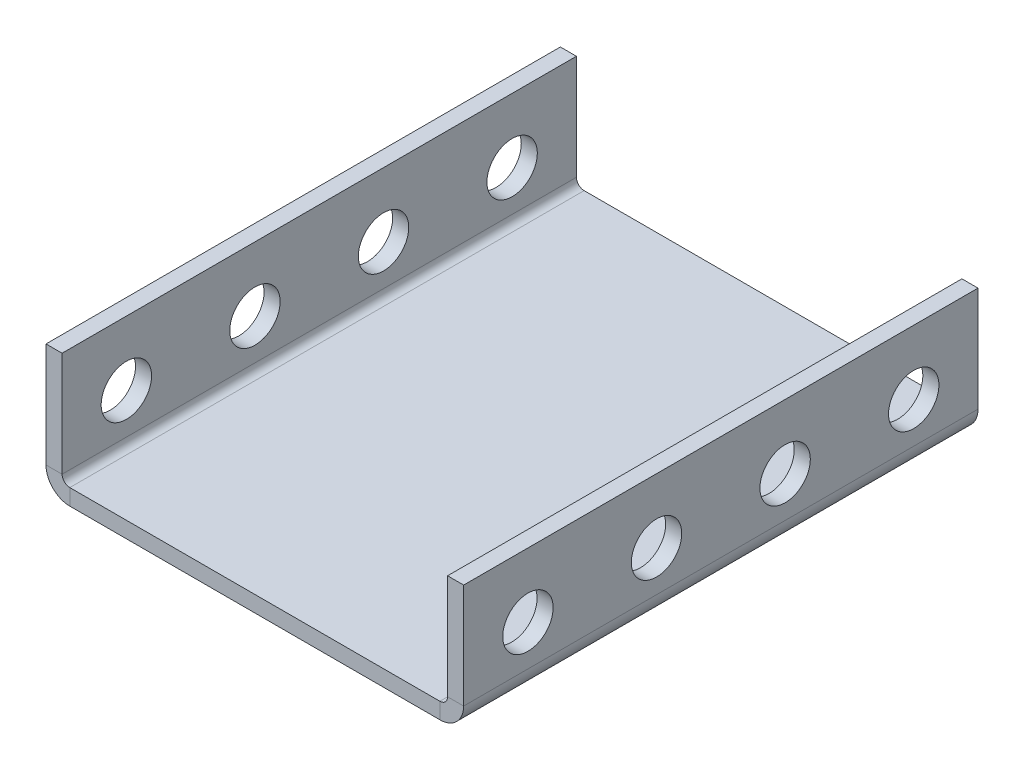
ISO-10303-21;
HEADER;
FILE_DESCRIPTION(('STEP AP214'),'2;1');
FILE_NAME('part.step','',(''),(''),'','','');
FILE_SCHEMA(('AUTOMOTIVE_DESIGN { 1 0 10303 214 1 1 1 1 }'));
ENDSEC;
DATA;
#1=APPLICATION_CONTEXT('core data for automotive mechanical design processes');
#2=APPLICATION_PROTOCOL_DEFINITION('international standard','automotive_design',2000,#1);
#3=PRODUCT_CONTEXT('',#1,'mechanical');
#4=PRODUCT('Part','Part','',(#3));
#5=PRODUCT_RELATED_PRODUCT_CATEGORY('part','',(#4));
#6=PRODUCT_DEFINITION_FORMATION('','',#4);
#7=PRODUCT_DEFINITION_CONTEXT('part definition',#1,'design');
#8=PRODUCT_DEFINITION('design','',#6,#7);
#9=PRODUCT_DEFINITION_SHAPE('','',#8);
#10=(LENGTH_UNIT() NAMED_UNIT(*) SI_UNIT(.MILLI.,.METRE.));
#11=(NAMED_UNIT(*) PLANE_ANGLE_UNIT() SI_UNIT($,.RADIAN.));
#12=(NAMED_UNIT(*) SI_UNIT($,.STERADIAN.) SOLID_ANGLE_UNIT());
#13=UNCERTAINTY_MEASURE_WITH_UNIT(LENGTH_MEASURE(1.E-05),#10,'distance_accuracy_value','');
#14=(GEOMETRIC_REPRESENTATION_CONTEXT(3) GLOBAL_UNCERTAINTY_ASSIGNED_CONTEXT((#13)) GLOBAL_UNIT_ASSIGNED_CONTEXT((#10,
#11,#12)) REPRESENTATION_CONTEXT('',''));
#15=CARTESIAN_POINT('',(0.,0.,0.));
#16=DIRECTION('',(0.,0.,1.));
#17=DIRECTION('',(1.,0.,0.));
#18=AXIS2_PLACEMENT_3D('',#15,#16,#17);
#19=CARTESIAN_POINT('',(18.2753,0.,50.8));
#20=DIRECTION('',(0.,0.,1.));
#21=DIRECTION('',(1.,0.,0.));
#22=AXIS2_PLACEMENT_3D('',#19,#20,#21);
#23=PLANE('',#22);
#24=DIRECTION('',(0.,1.,0.));
#25=VECTOR('',#24,1.);
#26=CARTESIAN_POINT('',(18.2753,0.,50.8));
#27=LINE('',#26,#25);
#28=CARTESIAN_POINT('',(18.2753,0.,50.8));
#29=VERTEX_POINT('',#28);
#30=CARTESIAN_POINT('',(18.2753,1.58750000000001,50.8));
#31=VERTEX_POINT('',#30);
#32=EDGE_CURVE('E11',#29,#31,#27,.T.);
#33=ORIENTED_EDGE('',*,*,#32,.F.);
#34=CARTESIAN_POINT('',(18.2753,2.34950000000001,50.8));
#35=DIRECTION('',(0.,0.,1.));
#36=DIRECTION('',(1.,0.,0.));
#37=AXIS2_PLACEMENT_3D('',#34,#35,#36);
#38=CIRCLE('',#37,2.3495);
#39=CARTESIAN_POINT('',(20.6248,2.34950000000001,50.8));
#40=VERTEX_POINT('',#39);
#41=EDGE_CURVE('E282',#40,#29,#38,.F.);
#42=ORIENTED_EDGE('',*,*,#41,.F.);
#43=DIRECTION('',(1.,0.,0.));
#44=VECTOR('',#43,1.);
#45=CARTESIAN_POINT('',(19.0373,2.34950000000001,50.8));
#46=LINE('',#45,#44);
#47=CARTESIAN_POINT('',(19.0373,2.34950000000001,50.8));
#48=VERTEX_POINT('',#47);
#49=EDGE_CURVE('E54',#48,#40,#46,.T.);
#50=ORIENTED_EDGE('',*,*,#49,.F.);
#51=CARTESIAN_POINT('',(18.2753,2.34950000000001,50.8));
#52=DIRECTION('',(0.,0.,1.));
#53=DIRECTION('',(1.,0.,0.));
#54=AXIS2_PLACEMENT_3D('',#51,#52,#53);
#55=CIRCLE('',#54,0.762);
#56=EDGE_CURVE('E156',#48,#31,#55,.F.);
#57=ORIENTED_EDGE('',*,*,#56,.T.);
#58=EDGE_LOOP('',(#33,#42,#50,#57));
#59=FACE_BOUND('',#58,.T.);
#60=ADVANCED_FACE('F45',(#59),#23,.T.);
#61=CARTESIAN_POINT('',(19.0373,2.34950000000001,50.8));
#62=DIRECTION('',(0.,0.,1.));
#63=DIRECTION('',(1.,0.,0.));
#64=AXIS2_PLACEMENT_3D('',#61,#62,#63);
#65=PLANE('',#64);
#66=DIRECTION('',(-1.,0.,0.));
#67=VECTOR('',#66,1.);
#68=CARTESIAN_POINT('',(-20.6248,0.,50.8));
#69=LINE('',#68,#67);
#70=CARTESIAN_POINT('',(-18.2753,0.,50.8));
#71=VERTEX_POINT('',#70);
#72=EDGE_CURVE('E150',#29,#71,#69,.T.);
#73=ORIENTED_EDGE('',*,*,#72,.F.);
#74=ORIENTED_EDGE('',*,*,#32,.T.);
#75=DIRECTION('',(-1.,0.,0.));
#76=VECTOR('',#75,1.);
#77=CARTESIAN_POINT('',(-20.6248,1.5875,50.8));
#78=LINE('',#77,#76);
#79=CARTESIAN_POINT('',(-18.2753,1.5875,50.8));
#80=VERTEX_POINT('',#79);
#81=EDGE_CURVE('E147',#31,#80,#78,.T.);
#82=ORIENTED_EDGE('',*,*,#81,.T.);
#83=DIRECTION('',(0.,-1.,0.));
#84=VECTOR('',#83,1.);
#85=CARTESIAN_POINT('',(-18.2753,1.5875,50.8));
#86=LINE('',#85,#84);
#87=EDGE_CURVE('E239',#80,#71,#86,.T.);
#88=ORIENTED_EDGE('',*,*,#87,.T.);
#89=EDGE_LOOP('',(#73,#74,#82,#88));
#90=FACE_BOUND('',#89,.T.);
#91=ADVANCED_FACE('F145',(#90),#65,.T.);
#92=CARTESIAN_POINT('',(20.6248,2.34950000000001,0.));
#93=DIRECTION('',(0.,0.,-1.));
#94=DIRECTION('',(-1.,0.,0.));
#95=AXIS2_PLACEMENT_3D('',#92,#93,#94);
#96=PLANE('',#95);
#97=DIRECTION('',(-1.,0.,0.));
#98=VECTOR('',#97,1.);
#99=CARTESIAN_POINT('',(20.6248,2.34950000000001,0.));
#100=LINE('',#99,#98);
#101=CARTESIAN_POINT('',(20.6248,2.34950000000001,0.));
#102=VERTEX_POINT('',#101);
#103=CARTESIAN_POINT('',(19.0373,2.34950000000001,0.));
#104=VERTEX_POINT('',#103);
#105=EDGE_CURVE('E244',#102,#104,#100,.T.);
#106=ORIENTED_EDGE('',*,*,#105,.F.);
#107=CARTESIAN_POINT('',(18.2753,2.34950000000001,0.));
#108=DIRECTION('',(0.,0.,1.));
#109=DIRECTION('',(1.,0.,0.));
#110=AXIS2_PLACEMENT_3D('',#107,#108,#109);
#111=CIRCLE('',#110,2.3495);
#112=CARTESIAN_POINT('',(18.2753,0.,0.));
#113=VERTEX_POINT('',#112);
#114=EDGE_CURVE('E196',#102,#113,#111,.F.);
#115=ORIENTED_EDGE('',*,*,#114,.T.);
#116=DIRECTION('',(0.,-1.,0.));
#117=VECTOR('',#116,1.);
#118=CARTESIAN_POINT('',(18.2753,1.58750000000001,0.));
#119=LINE('',#118,#117);
#120=CARTESIAN_POINT('',(18.2753,1.58750000000001,0.));
#121=VERTEX_POINT('',#120);
#122=EDGE_CURVE('E242',#121,#113,#119,.T.);
#123=ORIENTED_EDGE('',*,*,#122,.F.);
#124=CARTESIAN_POINT('',(18.2753,2.34950000000001,0.));
#125=DIRECTION('',(0.,0.,1.));
#126=DIRECTION('',(1.,0.,0.));
#127=AXIS2_PLACEMENT_3D('',#124,#125,#126);
#128=CIRCLE('',#127,0.762);
#129=EDGE_CURVE('E168',#104,#121,#128,.F.);
#130=ORIENTED_EDGE('',*,*,#129,.F.);
#131=EDGE_LOOP('',(#106,#115,#123,#130));
#132=FACE_BOUND('',#131,.T.);
#133=ADVANCED_FACE('F300',(#132),#96,.T.);
#134=CARTESIAN_POINT('',(18.2753,1.58750000000001,0.));
#135=DIRECTION('',(0.,0.,-1.));
#136=DIRECTION('',(-1.,0.,0.));
#137=AXIS2_PLACEMENT_3D('',#134,#135,#136);
#138=PLANE('',#137);
#139=DIRECTION('',(0.,-1.,0.));
#140=VECTOR('',#139,1.);
#141=CARTESIAN_POINT('',(20.6248,0.,0.));
#142=LINE('',#141,#140);
#143=CARTESIAN_POINT('',(20.6248,12.7,0.));
#144=VERTEX_POINT('',#143);
#145=EDGE_CURVE('E199',#144,#102,#142,.T.);
#146=ORIENTED_EDGE('',*,*,#145,.T.);
#147=ORIENTED_EDGE('',*,*,#105,.T.);
#148=DIRECTION('',(0.,-1.,0.));
#149=VECTOR('',#148,1.);
#150=CARTESIAN_POINT('',(19.0373,0.,0.));
#151=LINE('',#150,#149);
#152=CARTESIAN_POINT('',(19.0373,12.7,0.));
#153=VERTEX_POINT('',#152);
#154=EDGE_CURVE('E205',#153,#104,#151,.T.);
#155=ORIENTED_EDGE('',*,*,#154,.F.);
#156=DIRECTION('',(1.,0.,0.));
#157=VECTOR('',#156,1.);
#158=CARTESIAN_POINT('',(19.0373,12.7,0.));
#159=LINE('',#158,#157);
#160=EDGE_CURVE('E202',#153,#144,#159,.T.);
#161=ORIENTED_EDGE('',*,*,#160,.T.);
#162=EDGE_LOOP('',(#146,#147,#155,#161));
#163=FACE_BOUND('',#162,.T.);
#164=ADVANCED_FACE('F350',(#163),#138,.T.);
#165=CARTESIAN_POINT('',(-20.6248,2.3495,50.8));
#166=DIRECTION('',(0.,0.,1.));
#167=DIRECTION('',(1.,0.,0.));
#168=AXIS2_PLACEMENT_3D('',#165,#166,#167);
#169=PLANE('',#168);
#170=DIRECTION('',(1.,0.,0.));
#171=VECTOR('',#170,1.);
#172=CARTESIAN_POINT('',(-20.6248,2.3495,50.8));
#173=LINE('',#172,#171);
#174=CARTESIAN_POINT('',(-20.6248,2.3495,50.8));
#175=VERTEX_POINT('',#174);
#176=CARTESIAN_POINT('',(-19.0373,2.3495,50.8));
#177=VERTEX_POINT('',#176);
#178=EDGE_CURVE('E63',#175,#177,#173,.T.);
#179=ORIENTED_EDGE('',*,*,#178,.F.);
#180=CARTESIAN_POINT('',(-18.2753,2.3495,50.8));
#181=DIRECTION('',(0.,0.,1.));
#182=DIRECTION('',(1.,0.,0.));
#183=AXIS2_PLACEMENT_3D('',#180,#181,#182);
#184=CIRCLE('',#183,2.3495);
#185=EDGE_CURVE('E278',#71,#175,#184,.F.);
#186=ORIENTED_EDGE('',*,*,#185,.F.);
#187=ORIENTED_EDGE('',*,*,#87,.F.);
#188=CARTESIAN_POINT('',(-18.2753,2.3495,50.8));
#189=DIRECTION('',(0.,0.,1.));
#190=DIRECTION('',(1.,0.,0.));
#191=AXIS2_PLACEMENT_3D('',#188,#189,#190);
#192=CIRCLE('',#191,0.762);
#193=EDGE_CURVE('E176',#80,#177,#192,.F.);
#194=ORIENTED_EDGE('',*,*,#193,.T.);
#195=EDGE_LOOP('',(#179,#186,#187,#194));
#196=FACE_BOUND('',#195,.T.);
#197=ADVANCED_FACE('F355',(#196),#169,.T.);
#198=CARTESIAN_POINT('',(-18.2753,1.5875,50.8));
#199=DIRECTION('',(0.,0.,1.));
#200=DIRECTION('',(1.,0.,0.));
#201=AXIS2_PLACEMENT_3D('',#198,#199,#200);
#202=PLANE('',#201);
#203=DIRECTION('',(0.,1.,0.));
#204=VECTOR('',#203,1.);
#205=CARTESIAN_POINT('',(-20.6248,0.,50.8));
#206=LINE('',#205,#204);
#207=CARTESIAN_POINT('',(-20.6248,12.7,50.8));
#208=VERTEX_POINT('',#207);
#209=EDGE_CURVE('E275',#175,#208,#206,.T.);
#210=ORIENTED_EDGE('',*,*,#209,.F.);
#211=ORIENTED_EDGE('',*,*,#178,.T.);
#212=DIRECTION('',(0.,1.,0.));
#213=VECTOR('',#212,1.);
#214=CARTESIAN_POINT('',(-19.0373,0.,50.8));
#215=LINE('',#214,#213);
#216=CARTESIAN_POINT('',(-19.0373,12.7,50.8));
#217=VERTEX_POINT('',#216);
#218=EDGE_CURVE('E117',#177,#217,#215,.T.);
#219=ORIENTED_EDGE('',*,*,#218,.T.);
#220=DIRECTION('',(1.,0.,0.));
#221=VECTOR('',#220,1.);
#222=CARTESIAN_POINT('',(-20.6248,12.7,50.8));
#223=LINE('',#222,#221);
#224=EDGE_CURVE('E272',#208,#217,#223,.T.);
#225=ORIENTED_EDGE('',*,*,#224,.F.);
#226=EDGE_LOOP('',(#210,#211,#219,#225));
#227=FACE_BOUND('',#226,.T.);
#228=ADVANCED_FACE('F327',(#227),#202,.T.);
#229=CARTESIAN_POINT('',(-18.2753,0.,0.));
#230=DIRECTION('',(0.,0.,-1.));
#231=DIRECTION('',(-1.,0.,0.));
#232=AXIS2_PLACEMENT_3D('',#229,#230,#231);
#233=PLANE('',#232);
#234=DIRECTION('',(0.,1.,0.));
#235=VECTOR('',#234,1.);
#236=CARTESIAN_POINT('',(-18.2753,0.,0.));
#237=LINE('',#236,#235);
#238=CARTESIAN_POINT('',(-18.2753,0.,0.));
#239=VERTEX_POINT('',#238);
#240=CARTESIAN_POINT('',(-18.2753,1.5875,0.));
#241=VERTEX_POINT('',#240);
#242=EDGE_CURVE('E104',#239,#241,#237,.T.);
#243=ORIENTED_EDGE('',*,*,#242,.F.);
#244=CARTESIAN_POINT('',(-18.2753,2.3495,0.));
#245=DIRECTION('',(0.,0.,1.));
#246=DIRECTION('',(1.,0.,0.));
#247=AXIS2_PLACEMENT_3D('',#244,#245,#246);
#248=CIRCLE('',#247,2.3495);
#249=CARTESIAN_POINT('',(-20.6248,2.3495,0.));
#250=VERTEX_POINT('',#249);
#251=EDGE_CURVE('E192',#239,#250,#248,.F.);
#252=ORIENTED_EDGE('',*,*,#251,.T.);
#253=DIRECTION('',(-1.,0.,0.));
#254=VECTOR('',#253,1.);
#255=CARTESIAN_POINT('',(-19.0373,2.3495,0.));
#256=LINE('',#255,#254);
#257=CARTESIAN_POINT('',(-19.0373,2.3495,0.));
#258=VERTEX_POINT('',#257);
#259=EDGE_CURVE('E111',#258,#250,#256,.T.);
#260=ORIENTED_EDGE('',*,*,#259,.F.);
#261=CARTESIAN_POINT('',(-18.2753,2.3495,0.));
#262=DIRECTION('',(0.,0.,1.));
#263=DIRECTION('',(1.,0.,0.));
#264=AXIS2_PLACEMENT_3D('',#261,#262,#263);
#265=CIRCLE('',#264,0.762);
#266=EDGE_CURVE('E211',#241,#258,#265,.F.);
#267=ORIENTED_EDGE('',*,*,#266,.F.);
#268=EDGE_LOOP('',(#243,#252,#260,#267));
#269=FACE_BOUND('',#268,.T.);
#270=ADVANCED_FACE('F315',(#269),#233,.T.);
#271=CARTESIAN_POINT('',(-19.0373,2.3495,0.));
#272=DIRECTION('',(0.,0.,-1.));
#273=DIRECTION('',(-1.,0.,0.));
#274=AXIS2_PLACEMENT_3D('',#271,#272,#273);
#275=PLANE('',#274);
#276=DIRECTION('',(-1.,0.,0.));
#277=VECTOR('',#276,1.);
#278=CARTESIAN_POINT('',(-20.6248,0.,0.));
#279=LINE('',#278,#277);
#280=EDGE_CURVE('E194',#113,#239,#279,.T.);
#281=ORIENTED_EDGE('',*,*,#280,.T.);
#282=ORIENTED_EDGE('',*,*,#242,.T.);
#283=DIRECTION('',(-1.,0.,0.));
#284=VECTOR('',#283,1.);
#285=CARTESIAN_POINT('',(-20.6248,1.5875,0.));
#286=LINE('',#285,#284);
#287=EDGE_CURVE('E209',#121,#241,#286,.T.);
#288=ORIENTED_EDGE('',*,*,#287,.F.);
#289=ORIENTED_EDGE('',*,*,#122,.T.);
#290=EDGE_LOOP('',(#281,#282,#288,#289));
#291=FACE_BOUND('',#290,.T.);
#292=ADVANCED_FACE('F302',(#291),#275,.T.);
#293=CARTESIAN_POINT('',(-19.0373,0.,50.8));
#294=DIRECTION('',(-1.,0.,0.));
#295=DIRECTION('',(0.,-1.,0.));
#296=AXIS2_PLACEMENT_3D('',#293,#294,#295);
#297=PLANE('',#296);
#298=CARTESIAN_POINT('',(-19.0373,6.35000000000001,44.45));
#299=DIRECTION('',(-1.,0.,0.));
#300=DIRECTION('',(0.,-1.,0.));
#301=AXIS2_PLACEMENT_3D('',#298,#299,#300);
#302=CIRCLE('',#301,2.4892);
#303=CARTESIAN_POINT('',(-19.0373,3.86080000000001,44.45));
#304=VERTEX_POINT('',#303);
#305=EDGE_CURVE('E186',#304,#304,#302,.T.);
#306=ORIENTED_EDGE('',*,*,#305,.T.);
#307=EDGE_LOOP('',(#306));
#308=FACE_BOUND('',#307,.T.);
#309=CARTESIAN_POINT('',(-19.0373,6.35000000000001,31.75));
#310=DIRECTION('',(-1.,0.,0.));
#311=DIRECTION('',(0.,-1.,0.));
#312=AXIS2_PLACEMENT_3D('',#309,#310,#311);
#313=CIRCLE('',#312,2.4892);
#314=CARTESIAN_POINT('',(-19.0373,3.8608,31.75));
#315=VERTEX_POINT('',#314);
#316=EDGE_CURVE('E257',#315,#315,#313,.T.);
#317=ORIENTED_EDGE('',*,*,#316,.T.);
#318=EDGE_LOOP('',(#317));
#319=FACE_BOUND('',#318,.T.);
#320=CARTESIAN_POINT('',(-19.0373,6.35000000000001,19.05));
#321=DIRECTION('',(-1.,0.,0.));
#322=DIRECTION('',(0.,-1.,0.));
#323=AXIS2_PLACEMENT_3D('',#320,#321,#322);
#324=CIRCLE('',#323,2.4892);
#325=CARTESIAN_POINT('',(-19.0373,3.86080000000001,19.05));
#326=VERTEX_POINT('',#325);
#327=EDGE_CURVE('E254',#326,#326,#324,.T.);
#328=ORIENTED_EDGE('',*,*,#327,.T.);
#329=EDGE_LOOP('',(#328));
#330=FACE_BOUND('',#329,.T.);
#331=CARTESIAN_POINT('',(-19.0373,6.35000000000001,6.35000000000001));
#332=DIRECTION('',(-1.,0.,0.));
#333=DIRECTION('',(0.,-1.,0.));
#334=AXIS2_PLACEMENT_3D('',#331,#332,#333);
#335=CIRCLE('',#334,2.4892);
#336=CARTESIAN_POINT('',(-19.0373,3.86080000000001,6.35000000000001));
#337=VERTEX_POINT('',#336);
#338=EDGE_CURVE('E250',#337,#337,#335,.T.);
#339=ORIENTED_EDGE('',*,*,#338,.T.);
#340=EDGE_LOOP('',(#339));
#341=FACE_BOUND('',#340,.T.);
#342=DIRECTION('',(0.,1.,0.));
#343=VECTOR('',#342,1.);
#344=CARTESIAN_POINT('',(-19.0373,0.,0.));
#345=LINE('',#344,#343);
#346=CARTESIAN_POINT('',(-19.0373,12.7,0.));
#347=VERTEX_POINT('',#346);
#348=EDGE_CURVE('E182',#258,#347,#345,.T.);
#349=ORIENTED_EDGE('',*,*,#348,.T.);
#350=DIRECTION('',(0.,0.,-1.));
#351=VECTOR('',#350,1.);
#352=CARTESIAN_POINT('',(-19.0373,12.7,50.8));
#353=LINE('',#352,#351);
#354=EDGE_CURVE('E235',#217,#347,#353,.T.);
#355=ORIENTED_EDGE('',*,*,#354,.F.);
#356=ORIENTED_EDGE('',*,*,#218,.F.);
#357=DIRECTION('',(0.,0.,-1.));
#358=VECTOR('',#357,1.);
#359=CARTESIAN_POINT('',(-19.0373,2.3495,50.8));
#360=LINE('',#359,#358);
#361=EDGE_CURVE('E178',#177,#258,#360,.T.);
#362=ORIENTED_EDGE('',*,*,#361,.T.);
#363=EDGE_LOOP('',(#349,#355,#356,#362));
#364=FACE_BOUND('',#363,.T.);
#365=ADVANCED_FACE('F321',(#308,#319,#330,#341,#364),#297,.F.);
#366=CARTESIAN_POINT('',(-20.6248,12.7,50.8));
#367=DIRECTION('',(0.,1.,0.));
#368=DIRECTION('',(0.,0.,1.));
#369=AXIS2_PLACEMENT_3D('',#366,#367,#368);
#370=PLANE('',#369);
#371=DIRECTION('',(1.,0.,0.));
#372=VECTOR('',#371,1.);
#373=CARTESIAN_POINT('',(-20.6248,12.7,0.));
#374=LINE('',#373,#372);
#375=CARTESIAN_POINT('',(-20.6248,12.7,0.));
#376=VERTEX_POINT('',#375);
#377=EDGE_CURVE('E185',#376,#347,#374,.T.);
#378=ORIENTED_EDGE('',*,*,#377,.F.);
#379=DIRECTION('',(0.,0.,-1.));
#380=VECTOR('',#379,1.);
#381=CARTESIAN_POINT('',(-20.6248,12.7,50.8));
#382=LINE('',#381,#380);
#383=EDGE_CURVE('E233',#208,#376,#382,.T.);
#384=ORIENTED_EDGE('',*,*,#383,.F.);
#385=ORIENTED_EDGE('',*,*,#224,.T.);
#386=ORIENTED_EDGE('',*,*,#354,.T.);
#387=EDGE_LOOP('',(#378,#384,#385,#386));
#388=FACE_BOUND('',#387,.T.);
#389=ADVANCED_FACE('F326',(#388),#370,.T.);
#390=CARTESIAN_POINT('',(-20.6248,0.,50.8));
#391=DIRECTION('',(-1.,0.,0.));
#392=DIRECTION('',(0.,-1.,0.));
#393=AXIS2_PLACEMENT_3D('',#390,#391,#392);
#394=PLANE('',#393);
#395=CARTESIAN_POINT('',(-20.6248,6.35000000000001,44.45));
#396=DIRECTION('',(1.,0.,0.));
#397=DIRECTION('',(0.,0.,-1.));
#398=AXIS2_PLACEMENT_3D('',#395,#396,#397);
#399=CIRCLE('',#398,2.4892);
#400=CARTESIAN_POINT('',(-20.6248,6.35000000000001,41.9608));
#401=VERTEX_POINT('',#400);
#402=EDGE_CURVE('E251',#401,#401,#399,.T.);
#403=ORIENTED_EDGE('',*,*,#402,.T.);
#404=EDGE_LOOP('',(#403));
#405=FACE_BOUND('',#404,.T.);
#406=CARTESIAN_POINT('',(-20.6248,6.35000000000001,31.75));
#407=DIRECTION('',(1.,0.,0.));
#408=DIRECTION('',(0.,0.,-1.));
#409=AXIS2_PLACEMENT_3D('',#406,#407,#408);
#410=CIRCLE('',#409,2.4892);
#411=CARTESIAN_POINT('',(-20.6248,6.35000000000001,29.2608));
#412=VERTEX_POINT('',#411);
#413=EDGE_CURVE('E676',#412,#412,#410,.T.);
#414=ORIENTED_EDGE('',*,*,#413,.T.);
#415=EDGE_LOOP('',(#414));
#416=FACE_BOUND('',#415,.T.);
#417=CARTESIAN_POINT('',(-20.6248,6.35000000000001,19.05));
#418=DIRECTION('',(1.,0.,0.));
#419=DIRECTION('',(0.,0.,-1.));
#420=AXIS2_PLACEMENT_3D('',#417,#418,#419);
#421=CIRCLE('',#420,2.4892);
#422=CARTESIAN_POINT('',(-20.6248,6.35000000000001,16.5608));
#423=VERTEX_POINT('',#422);
#424=EDGE_CURVE('E682',#423,#423,#421,.T.);
#425=ORIENTED_EDGE('',*,*,#424,.T.);
#426=EDGE_LOOP('',(#425));
#427=FACE_BOUND('',#426,.T.);
#428=CARTESIAN_POINT('',(-20.6248,6.35000000000001,6.35000000000001));
#429=DIRECTION('',(1.,0.,0.));
#430=DIRECTION('',(0.,0.,-1.));
#431=AXIS2_PLACEMENT_3D('',#428,#429,#430);
#432=CIRCLE('',#431,2.4892);
#433=CARTESIAN_POINT('',(-20.6248,6.35000000000001,3.86080000000001));
#434=VERTEX_POINT('',#433);
#435=EDGE_CURVE('E687',#434,#434,#432,.T.);
#436=ORIENTED_EDGE('',*,*,#435,.T.);
#437=EDGE_LOOP('',(#436));
#438=FACE_BOUND('',#437,.T.);
#439=DIRECTION('',(0.,1.,0.));
#440=VECTOR('',#439,1.);
#441=CARTESIAN_POINT('',(-20.6248,0.,0.));
#442=LINE('',#441,#440);
#443=EDGE_CURVE('E189',#250,#376,#442,.T.);
#444=ORIENTED_EDGE('',*,*,#443,.F.);
#445=DIRECTION('',(0.,0.,-1.));
#446=VECTOR('',#445,1.);
#447=CARTESIAN_POINT('',(-20.6248,2.3495,50.8));
#448=LINE('',#447,#446);
#449=EDGE_CURVE('E230',#175,#250,#448,.T.);
#450=ORIENTED_EDGE('',*,*,#449,.F.);
#451=ORIENTED_EDGE('',*,*,#209,.T.);
#452=ORIENTED_EDGE('',*,*,#383,.T.);
#453=EDGE_LOOP('',(#444,#450,#451,#452));
#454=FACE_BOUND('',#453,.T.);
#455=ADVANCED_FACE('F329',(#405,#416,#427,#438,#454),#394,.T.);
#456=CARTESIAN_POINT('',(-18.2753,2.3495,50.8));
#457=DIRECTION('',(0.,0.,-1.));
#458=DIRECTION('',(-1.,0.,0.));
#459=AXIS2_PLACEMENT_3D('',#456,#457,#458);
#460=CYLINDRICAL_SURFACE('',#459,2.3495);
#461=ORIENTED_EDGE('',*,*,#251,.F.);
#462=DIRECTION('',(0.,0.,-1.));
#463=VECTOR('',#462,1.);
#464=CARTESIAN_POINT('',(-18.2753,0.,50.8));
#465=LINE('',#464,#463);
#466=EDGE_CURVE('E227',#71,#239,#465,.T.);
#467=ORIENTED_EDGE('',*,*,#466,.F.);
#468=ORIENTED_EDGE('',*,*,#185,.T.);
#469=ORIENTED_EDGE('',*,*,#449,.T.);
#470=EDGE_LOOP('',(#461,#467,#468,#469));
#471=FACE_BOUND('',#470,.T.);
#472=ADVANCED_FACE('F312',(#471),#460,.T.);
#473=CARTESIAN_POINT('',(-20.6248,0.,50.8));
#474=DIRECTION('',(0.,-1.,0.));
#475=DIRECTION('',(1.,0.,0.));
#476=AXIS2_PLACEMENT_3D('',#473,#474,#475);
#477=PLANE('',#476);
#478=ORIENTED_EDGE('',*,*,#280,.F.);
#479=DIRECTION('',(0.,0.,-1.));
#480=VECTOR('',#479,1.);
#481=CARTESIAN_POINT('',(18.2753,0.,50.8));
#482=LINE('',#481,#480);
#483=EDGE_CURVE('E224',#29,#113,#482,.T.);
#484=ORIENTED_EDGE('',*,*,#483,.F.);
#485=ORIENTED_EDGE('',*,*,#72,.T.);
#486=ORIENTED_EDGE('',*,*,#466,.T.);
#487=EDGE_LOOP('',(#478,#484,#485,#486));
#488=FACE_BOUND('',#487,.T.);
#489=ADVANCED_FACE('F307',(#488),#477,.T.);
#490=CARTESIAN_POINT('',(18.2753,2.34950000000001,50.8));
#491=DIRECTION('',(0.,0.,-1.));
#492=DIRECTION('',(-1.,0.,0.));
#493=AXIS2_PLACEMENT_3D('',#490,#491,#492);
#494=CYLINDRICAL_SURFACE('',#493,2.3495);
#495=ORIENTED_EDGE('',*,*,#114,.F.);
#496=DIRECTION('',(0.,0.,-1.));
#497=VECTOR('',#496,1.);
#498=CARTESIAN_POINT('',(20.6248,2.34950000000001,50.8));
#499=LINE('',#498,#497);
#500=EDGE_CURVE('E221',#40,#102,#499,.T.);
#501=ORIENTED_EDGE('',*,*,#500,.F.);
#502=ORIENTED_EDGE('',*,*,#41,.T.);
#503=ORIENTED_EDGE('',*,*,#483,.T.);
#504=EDGE_LOOP('',(#495,#501,#502,#503));
#505=FACE_BOUND('',#504,.T.);
#506=ADVANCED_FACE('F305',(#505),#494,.T.);
#507=CARTESIAN_POINT('',(20.6248,0.,50.8));
#508=DIRECTION('',(1.,0.,0.));
#509=DIRECTION('',(0.,1.,0.));
#510=AXIS2_PLACEMENT_3D('',#507,#508,#509);
#511=PLANE('',#510);
#512=CARTESIAN_POINT('',(20.6248,6.35000000000001,44.45));
#513=DIRECTION('',(1.,0.,0.));
#514=DIRECTION('',(0.,0.,-1.));
#515=AXIS2_PLACEMENT_3D('',#512,#513,#514);
#516=CIRCLE('',#515,2.4892);
#517=CARTESIAN_POINT('',(20.6248,6.35000000000001,41.9608));
#518=VERTEX_POINT('',#517);
#519=EDGE_CURVE('E670',#518,#518,#516,.T.);
#520=ORIENTED_EDGE('',*,*,#519,.F.);
#521=EDGE_LOOP('',(#520));
#522=FACE_BOUND('',#521,.T.);
#523=CARTESIAN_POINT('',(20.6248,6.35000000000001,31.75));
#524=DIRECTION('',(1.,0.,0.));
#525=DIRECTION('',(0.,0.,-1.));
#526=AXIS2_PLACEMENT_3D('',#523,#524,#525);
#527=CIRCLE('',#526,2.4892);
#528=CARTESIAN_POINT('',(20.6248,6.35000000000001,29.2608));
#529=VERTEX_POINT('',#528);
#530=EDGE_CURVE('E673',#529,#529,#527,.T.);
#531=ORIENTED_EDGE('',*,*,#530,.F.);
#532=EDGE_LOOP('',(#531));
#533=FACE_BOUND('',#532,.T.);
#534=CARTESIAN_POINT('',(20.6248,6.35000000000001,19.05));
#535=DIRECTION('',(1.,0.,0.));
#536=DIRECTION('',(0.,0.,-1.));
#537=AXIS2_PLACEMENT_3D('',#534,#535,#536);
#538=CIRCLE('',#537,2.4892);
#539=CARTESIAN_POINT('',(20.6248,6.35000000000001,16.5608));
#540=VERTEX_POINT('',#539);
#541=EDGE_CURVE('E679',#540,#540,#538,.T.);
#542=ORIENTED_EDGE('',*,*,#541,.F.);
#543=EDGE_LOOP('',(#542));
#544=FACE_BOUND('',#543,.T.);
#545=CARTESIAN_POINT('',(20.6248,6.35000000000001,6.35000000000001));
#546=DIRECTION('',(1.,0.,0.));
#547=DIRECTION('',(0.,0.,-1.));
#548=AXIS2_PLACEMENT_3D('',#545,#546,#547);
#549=CIRCLE('',#548,2.4892);
#550=CARTESIAN_POINT('',(20.6248,6.35000000000001,3.86080000000001));
#551=VERTEX_POINT('',#550);
#552=EDGE_CURVE('E409',#551,#551,#549,.T.);
#553=ORIENTED_EDGE('',*,*,#552,.F.);
#554=EDGE_LOOP('',(#553));
#555=FACE_BOUND('',#554,.T.);
#556=ORIENTED_EDGE('',*,*,#145,.F.);
#557=DIRECTION('',(0.,0.,-1.));
#558=VECTOR('',#557,1.);
#559=CARTESIAN_POINT('',(20.6248,12.7,50.8));
#560=LINE('',#559,#558);
#561=CARTESIAN_POINT('',(20.6248,12.7,50.8));
#562=VERTEX_POINT('',#561);
#563=EDGE_CURVE('E219',#562,#144,#560,.T.);
#564=ORIENTED_EDGE('',*,*,#563,.F.);
#565=DIRECTION('',(0.,-1.,0.));
#566=VECTOR('',#565,1.);
#567=CARTESIAN_POINT('',(20.6248,0.,50.8));
#568=LINE('',#567,#566);
#569=EDGE_CURVE('E284',#562,#40,#568,.T.);
#570=ORIENTED_EDGE('',*,*,#569,.T.);
#571=ORIENTED_EDGE('',*,*,#500,.T.);
#572=EDGE_LOOP('',(#556,#564,#570,#571));
#573=FACE_BOUND('',#572,.T.);
#574=ADVANCED_FACE('F420',(#522,#533,#544,#555,#573),#511,.T.);
#575=CARTESIAN_POINT('',(19.0373,12.7,50.8));
#576=DIRECTION('',(0.,1.,0.));
#577=DIRECTION('',(0.,0.,1.));
#578=AXIS2_PLACEMENT_3D('',#575,#576,#577);
#579=PLANE('',#578);
#580=ORIENTED_EDGE('',*,*,#160,.F.);
#581=DIRECTION('',(0.,0.,-1.));
#582=VECTOR('',#581,1.);
#583=CARTESIAN_POINT('',(19.0373,12.7,50.8));
#584=LINE('',#583,#582);
#585=CARTESIAN_POINT('',(19.0373,12.7,50.8));
#586=VERTEX_POINT('',#585);
#587=EDGE_CURVE('E217',#586,#153,#584,.T.);
#588=ORIENTED_EDGE('',*,*,#587,.F.);
#589=DIRECTION('',(1.,0.,0.));
#590=VECTOR('',#589,1.);
#591=CARTESIAN_POINT('',(19.0373,12.7,50.8));
#592=LINE('',#591,#590);
#593=EDGE_CURVE('E287',#586,#562,#592,.T.);
#594=ORIENTED_EDGE('',*,*,#593,.T.);
#595=ORIENTED_EDGE('',*,*,#563,.T.);
#596=EDGE_LOOP('',(#580,#588,#594,#595));
#597=FACE_BOUND('',#596,.T.);
#598=ADVANCED_FACE('F412',(#597),#579,.T.);
#599=CARTESIAN_POINT('',(19.0373,0.,50.8));
#600=DIRECTION('',(1.,0.,0.));
#601=DIRECTION('',(0.,1.,0.));
#602=AXIS2_PLACEMENT_3D('',#599,#600,#601);
#603=PLANE('',#602);
#604=CARTESIAN_POINT('',(19.0373,6.35000000000001,44.45));
#605=DIRECTION('',(1.,0.,0.));
#606=DIRECTION('',(0.,1.,0.));
#607=AXIS2_PLACEMENT_3D('',#604,#605,#606);
#608=CIRCLE('',#607,2.4892);
#609=CARTESIAN_POINT('',(19.0373,8.8392,44.45));
#610=VERTEX_POINT('',#609);
#611=EDGE_CURVE('E48',#610,#610,#608,.T.);
#612=ORIENTED_EDGE('',*,*,#611,.T.);
#613=EDGE_LOOP('',(#612));
#614=FACE_BOUND('',#613,.T.);
#615=CARTESIAN_POINT('',(19.0373,6.35000000000001,31.75));
#616=DIRECTION('',(1.,0.,0.));
#617=DIRECTION('',(0.,1.,0.));
#618=AXIS2_PLACEMENT_3D('',#615,#616,#617);
#619=CIRCLE('',#618,2.4892);
#620=CARTESIAN_POINT('',(19.0373,8.83920000000001,31.75));
#621=VERTEX_POINT('',#620);
#622=EDGE_CURVE('E255',#621,#621,#619,.T.);
#623=ORIENTED_EDGE('',*,*,#622,.T.);
#624=EDGE_LOOP('',(#623));
#625=FACE_BOUND('',#624,.T.);
#626=CARTESIAN_POINT('',(19.0373,6.35000000000001,19.05));
#627=DIRECTION('',(1.,0.,0.));
#628=DIRECTION('',(0.,1.,0.));
#629=AXIS2_PLACEMENT_3D('',#626,#627,#628);
#630=CIRCLE('',#629,2.4892);
#631=CARTESIAN_POINT('',(19.0373,8.8392,19.05));
#632=VERTEX_POINT('',#631);
#633=EDGE_CURVE('E252',#632,#632,#630,.T.);
#634=ORIENTED_EDGE('',*,*,#633,.T.);
#635=EDGE_LOOP('',(#634));
#636=FACE_BOUND('',#635,.T.);
#637=CARTESIAN_POINT('',(19.0373,6.35000000000001,6.35000000000001));
#638=DIRECTION('',(1.,0.,0.));
#639=DIRECTION('',(0.,1.,0.));
#640=AXIS2_PLACEMENT_3D('',#637,#638,#639);
#641=CIRCLE('',#640,2.4892);
#642=CARTESIAN_POINT('',(19.0373,8.8392,6.35000000000001));
#643=VERTEX_POINT('',#642);
#644=EDGE_CURVE('E247',#643,#643,#641,.T.);
#645=ORIENTED_EDGE('',*,*,#644,.T.);
#646=EDGE_LOOP('',(#645));
#647=FACE_BOUND('',#646,.T.);
#648=ORIENTED_EDGE('',*,*,#154,.T.);
#649=DIRECTION('',(0.,0.,-1.));
#650=VECTOR('',#649,1.);
#651=CARTESIAN_POINT('',(19.0373,2.34950000000001,50.8));
#652=LINE('',#651,#650);
#653=EDGE_CURVE('E170',#48,#104,#652,.T.);
#654=ORIENTED_EDGE('',*,*,#653,.F.);
#655=DIRECTION('',(0.,-1.,0.));
#656=VECTOR('',#655,1.);
#657=CARTESIAN_POINT('',(19.0373,0.,50.8));
#658=LINE('',#657,#656);
#659=EDGE_CURVE('E161',#586,#48,#658,.T.);
#660=ORIENTED_EDGE('',*,*,#659,.F.);
#661=ORIENTED_EDGE('',*,*,#587,.T.);
#662=EDGE_LOOP('',(#648,#654,#660,#661));
#663=FACE_BOUND('',#662,.T.);
#664=ADVANCED_FACE('F297',(#614,#625,#636,#647,#663),#603,.F.);
#665=CARTESIAN_POINT('',(18.2753,2.34950000000001,50.8));
#666=DIRECTION('',(0.,0.,-1.));
#667=DIRECTION('',(-1.,0.,0.));
#668=AXIS2_PLACEMENT_3D('',#665,#666,#667);
#669=CYLINDRICAL_SURFACE('',#668,0.762);
#670=ORIENTED_EDGE('',*,*,#129,.T.);
#671=DIRECTION('',(0.,0.,-1.));
#672=VECTOR('',#671,1.);
#673=CARTESIAN_POINT('',(18.2753,1.58750000000001,50.8));
#674=LINE('',#673,#672);
#675=EDGE_CURVE('E165',#31,#121,#674,.T.);
#676=ORIENTED_EDGE('',*,*,#675,.F.);
#677=ORIENTED_EDGE('',*,*,#56,.F.);
#678=ORIENTED_EDGE('',*,*,#653,.T.);
#679=EDGE_LOOP('',(#670,#676,#677,#678));
#680=FACE_BOUND('',#679,.T.);
#681=ADVANCED_FACE('F166',(#680),#669,.F.);
#682=CARTESIAN_POINT('',(-20.6248,1.5875,50.8));
#683=DIRECTION('',(0.,-1.,0.));
#684=DIRECTION('',(1.,0.,0.));
#685=AXIS2_PLACEMENT_3D('',#682,#683,#684);
#686=PLANE('',#685);
#687=ORIENTED_EDGE('',*,*,#287,.T.);
#688=DIRECTION('',(0.,0.,-1.));
#689=VECTOR('',#688,1.);
#690=CARTESIAN_POINT('',(-18.2753,1.5875,50.8));
#691=LINE('',#690,#689);
#692=EDGE_CURVE('E171',#80,#241,#691,.T.);
#693=ORIENTED_EDGE('',*,*,#692,.F.);
#694=ORIENTED_EDGE('',*,*,#81,.F.);
#695=ORIENTED_EDGE('',*,*,#675,.T.);
#696=EDGE_LOOP('',(#687,#693,#694,#695));
#697=FACE_BOUND('',#696,.T.);
#698=ADVANCED_FACE('F173',(#697),#686,.F.);
#699=CARTESIAN_POINT('',(-18.2753,2.3495,50.8));
#700=DIRECTION('',(0.,0.,-1.));
#701=DIRECTION('',(-1.,0.,0.));
#702=AXIS2_PLACEMENT_3D('',#699,#700,#701);
#703=CYLINDRICAL_SURFACE('',#702,0.762);
#704=ORIENTED_EDGE('',*,*,#266,.T.);
#705=ORIENTED_EDGE('',*,*,#361,.F.);
#706=ORIENTED_EDGE('',*,*,#193,.F.);
#707=ORIENTED_EDGE('',*,*,#692,.T.);
#708=EDGE_LOOP('',(#704,#705,#706,#707));
#709=FACE_BOUND('',#708,.T.);
#710=ADVANCED_FACE('F318',(#709),#703,.F.);
#711=CARTESIAN_POINT('',(-18.2753,2.3495,50.8));
#712=DIRECTION('',(0.,0.,1.));
#713=DIRECTION('',(1.,0.,0.));
#714=AXIS2_PLACEMENT_3D('',#711,#712,#713);
#715=PLANE('',#714);
#716=ORIENTED_EDGE('',*,*,#659,.T.);
#717=ORIENTED_EDGE('',*,*,#49,.T.);
#718=ORIENTED_EDGE('',*,*,#569,.F.);
#719=ORIENTED_EDGE('',*,*,#593,.F.);
#720=EDGE_LOOP('',(#716,#717,#718,#719));
#721=FACE_BOUND('',#720,.T.);
#722=ADVANCED_FACE('F293',(#721),#715,.T.);
#723=CARTESIAN_POINT('',(-18.2753,2.3495,0.));
#724=DIRECTION('',(0.,0.,1.));
#725=DIRECTION('',(1.,0.,0.));
#726=AXIS2_PLACEMENT_3D('',#723,#724,#725);
#727=PLANE('',#726);
#728=ORIENTED_EDGE('',*,*,#348,.F.);
#729=ORIENTED_EDGE('',*,*,#259,.T.);
#730=ORIENTED_EDGE('',*,*,#443,.T.);
#731=ORIENTED_EDGE('',*,*,#377,.T.);
#732=EDGE_LOOP('',(#728,#729,#730,#731));
#733=FACE_BOUND('',#732,.T.);
#734=ADVANCED_FACE('F323',(#733),#727,.F.);
#735=CARTESIAN_POINT('',(-20.6248,6.35000000000001,6.35000000000001));
#736=DIRECTION('',(1.,0.,0.));
#737=DIRECTION('',(0.,0.,-1.));
#738=AXIS2_PLACEMENT_3D('',#735,#736,#737);
#739=CYLINDRICAL_SURFACE('',#738,2.4892);
#740=ORIENTED_EDGE('',*,*,#552,.T.);
#741=EDGE_LOOP('',(#740));
#742=FACE_BOUND('',#741,.T.);
#743=ORIENTED_EDGE('',*,*,#644,.F.);
#744=EDGE_LOOP('',(#743));
#745=FACE_BOUND('',#744,.T.);
#746=ADVANCED_FACE('F383',(#742,#745),#739,.F.);
#747=CARTESIAN_POINT('',(-20.6248,6.35000000000001,19.05));
#748=DIRECTION('',(1.,0.,0.));
#749=DIRECTION('',(0.,0.,-1.));
#750=AXIS2_PLACEMENT_3D('',#747,#748,#749);
#751=CYLINDRICAL_SURFACE('',#750,2.4892);
#752=ORIENTED_EDGE('',*,*,#541,.T.);
#753=EDGE_LOOP('',(#752));
#754=FACE_BOUND('',#753,.T.);
#755=ORIENTED_EDGE('',*,*,#633,.F.);
#756=EDGE_LOOP('',(#755));
#757=FACE_BOUND('',#756,.T.);
#758=ADVANCED_FACE('F391',(#754,#757),#751,.F.);
#759=CARTESIAN_POINT('',(-20.6248,6.35000000000001,31.75));
#760=DIRECTION('',(1.,0.,0.));
#761=DIRECTION('',(0.,0.,-1.));
#762=AXIS2_PLACEMENT_3D('',#759,#760,#761);
#763=CYLINDRICAL_SURFACE('',#762,2.4892);
#764=ORIENTED_EDGE('',*,*,#530,.T.);
#765=EDGE_LOOP('',(#764));
#766=FACE_BOUND('',#765,.T.);
#767=ORIENTED_EDGE('',*,*,#622,.F.);
#768=EDGE_LOOP('',(#767));
#769=FACE_BOUND('',#768,.T.);
#770=ADVANCED_FACE('F392',(#766,#769),#763,.F.);
#771=CARTESIAN_POINT('',(-20.6248,6.35000000000001,44.45));
#772=DIRECTION('',(1.,0.,0.));
#773=DIRECTION('',(0.,0.,-1.));
#774=AXIS2_PLACEMENT_3D('',#771,#772,#773);
#775=CYLINDRICAL_SURFACE('',#774,2.4892);
#776=ORIENTED_EDGE('',*,*,#519,.T.);
#777=EDGE_LOOP('',(#776));
#778=FACE_BOUND('',#777,.T.);
#779=ORIENTED_EDGE('',*,*,#611,.F.);
#780=EDGE_LOOP('',(#779));
#781=FACE_BOUND('',#780,.T.);
#782=ADVANCED_FACE('F380',(#778,#781),#775,.F.);
#783=ORIENTED_EDGE('',*,*,#435,.F.);
#784=EDGE_LOOP('',(#783));
#785=FACE_BOUND('',#784,.T.);
#786=ORIENTED_EDGE('',*,*,#338,.F.);
#787=EDGE_LOOP('',(#786));
#788=FACE_BOUND('',#787,.T.);
#789=ADVANCED_FACE('F377',(#785,#788),#739,.F.);
#790=ORIENTED_EDGE('',*,*,#424,.F.);
#791=EDGE_LOOP('',(#790));
#792=FACE_BOUND('',#791,.T.);
#793=ORIENTED_EDGE('',*,*,#327,.F.);
#794=EDGE_LOOP('',(#793));
#795=FACE_BOUND('',#794,.T.);
#796=ADVANCED_FACE('F379',(#792,#795),#751,.F.);
#797=ORIENTED_EDGE('',*,*,#413,.F.);
#798=EDGE_LOOP('',(#797));
#799=FACE_BOUND('',#798,.T.);
#800=ORIENTED_EDGE('',*,*,#316,.F.);
#801=EDGE_LOOP('',(#800));
#802=FACE_BOUND('',#801,.T.);
#803=ADVANCED_FACE('F388',(#799,#802),#763,.F.);
#804=ORIENTED_EDGE('',*,*,#402,.F.);
#805=EDGE_LOOP('',(#804));
#806=FACE_BOUND('',#805,.T.);
#807=ORIENTED_EDGE('',*,*,#305,.F.);
#808=EDGE_LOOP('',(#807));
#809=FACE_BOUND('',#808,.T.);
#810=ADVANCED_FACE('F395',(#806,#809),#775,.F.);
#811=CLOSED_SHELL('',(#60,#91,#133,#164,#197,#228,#270,#292,#365,#389,#455,#472,#489,#506,#574,
#598,#664,#681,#698,#710,#722,#734,#746,#758,#770,#782,#789,#796,#803,#810));
#812=MANIFOLD_SOLID_BREP('B2',#811);
#813=ADVANCED_BREP_SHAPE_REPRESENTATION('',(#18,#812),#14);
#814=SHAPE_DEFINITION_REPRESENTATION(#9,#813);
ENDSEC;
END-ISO-10303-21;
